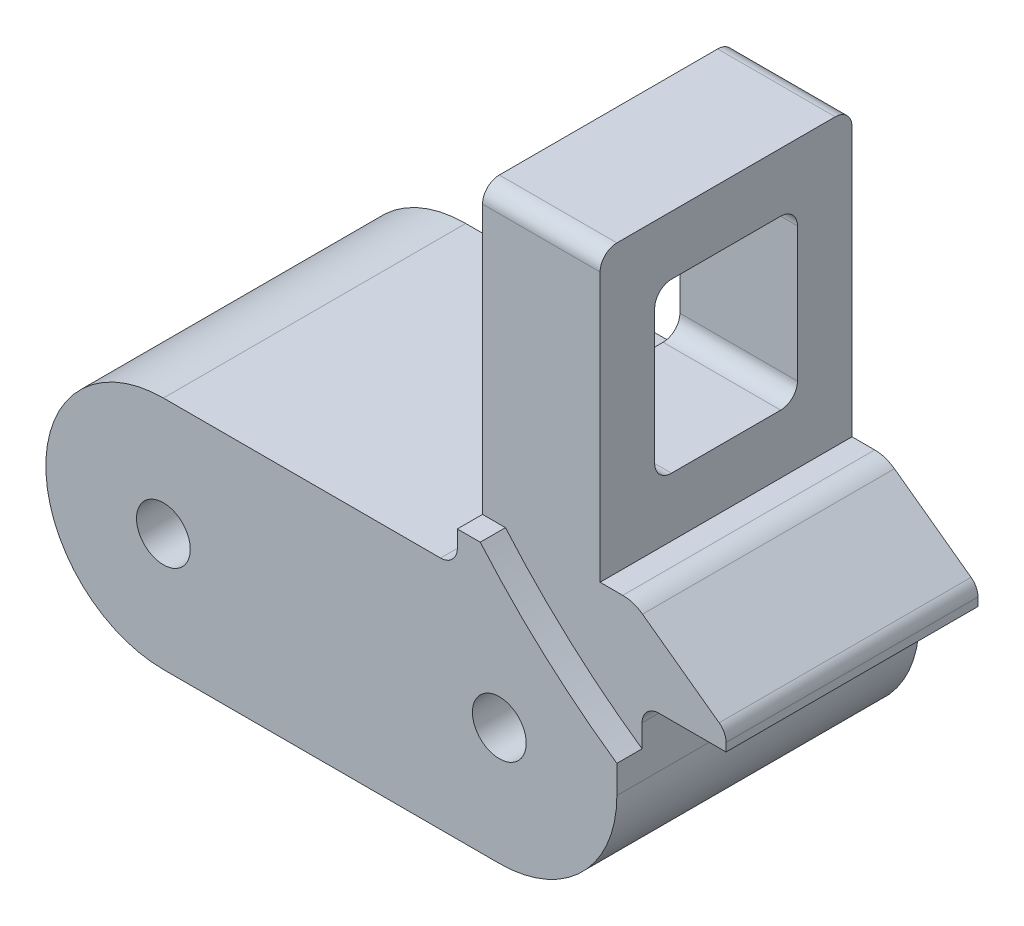
ISO-10303-21;
HEADER;
FILE_DESCRIPTION(('STEP AP214'),'2;1');
FILE_NAME('part.step','',(''),(''),'','','');
FILE_SCHEMA(('AUTOMOTIVE_DESIGN { 1 0 10303 214 1 1 1 1 }'));
ENDSEC;
DATA;
#1=APPLICATION_CONTEXT('core data for automotive mechanical design processes');
#2=APPLICATION_PROTOCOL_DEFINITION('international standard','automotive_design',2000,#1);
#3=PRODUCT_CONTEXT('',#1,'mechanical');
#4=PRODUCT('Part','Part','',(#3));
#5=PRODUCT_RELATED_PRODUCT_CATEGORY('part','',(#4));
#6=PRODUCT_DEFINITION_FORMATION('','',#4);
#7=PRODUCT_DEFINITION_CONTEXT('part definition',#1,'design');
#8=PRODUCT_DEFINITION('design','',#6,#7);
#9=PRODUCT_DEFINITION_SHAPE('','',#8);
#10=(LENGTH_UNIT() NAMED_UNIT(*) SI_UNIT(.MILLI.,.METRE.));
#11=(NAMED_UNIT(*) PLANE_ANGLE_UNIT() SI_UNIT($,.RADIAN.));
#12=(NAMED_UNIT(*) SI_UNIT($,.STERADIAN.) SOLID_ANGLE_UNIT());
#13=UNCERTAINTY_MEASURE_WITH_UNIT(LENGTH_MEASURE(1.E-05),#10,'distance_accuracy_value','');
#14=(GEOMETRIC_REPRESENTATION_CONTEXT(3) GLOBAL_UNCERTAINTY_ASSIGNED_CONTEXT((#13)) GLOBAL_UNIT_ASSIGNED_CONTEXT((#10,
#11,#12)) REPRESENTATION_CONTEXT('',''));
#15=CARTESIAN_POINT('',(0.,0.,0.));
#16=DIRECTION('',(0.,0.,1.));
#17=DIRECTION('',(1.,0.,0.));
#18=AXIS2_PLACEMENT_3D('',#15,#16,#17);
#19=CARTESIAN_POINT('',(0.,4.,14.));
#20=DIRECTION('',(0.,1.,0.));
#21=DIRECTION('',(0.,0.,1.));
#22=AXIS2_PLACEMENT_3D('',#19,#20,#21);
#23=PLANE('',#22);
#24=DIRECTION('',(0.,0.,-1.));
#25=VECTOR('',#24,1.);
#26=CARTESIAN_POINT('',(8.,4.,0.));
#27=LINE('',#26,#25);
#28=CARTESIAN_POINT('',(8.,4.,14.5));
#29=VERTEX_POINT('',#28);
#30=CARTESIAN_POINT('',(8.,4.,-0.5));
#31=VERTEX_POINT('',#30);
#32=EDGE_CURVE('E463',#29,#31,#27,.T.);
#33=ORIENTED_EDGE('',*,*,#32,.T.);
#34=DIRECTION('',(-1.,0.,0.));
#35=VECTOR('',#34,1.);
#36=CARTESIAN_POINT('',(12.,4.,-0.5));
#37=LINE('',#36,#35);
#38=CARTESIAN_POINT('',(12.,4.,-0.5));
#39=VERTEX_POINT('',#38);
#40=EDGE_CURVE('E328',#39,#31,#37,.T.);
#41=ORIENTED_EDGE('',*,*,#40,.F.);
#42=DIRECTION('',(0.,0.,-1.));
#43=VECTOR('',#42,1.);
#44=CARTESIAN_POINT('',(12.,4.,14.));
#45=LINE('',#44,#43);
#46=CARTESIAN_POINT('',(12.,4.,14.5));
#47=VERTEX_POINT('',#46);
#48=EDGE_CURVE('E457',#47,#39,#45,.T.);
#49=ORIENTED_EDGE('',*,*,#48,.F.);
#50=DIRECTION('',(1.,0.,0.));
#51=VECTOR('',#50,1.);
#52=CARTESIAN_POINT('',(8.,4.,14.5));
#53=LINE('',#52,#51);
#54=EDGE_CURVE('E357',#29,#47,#53,.T.);
#55=ORIENTED_EDGE('',*,*,#54,.F.);
#56=EDGE_LOOP('',(#33,#41,#49,#55));
#57=FACE_BOUND('',#56,.T.);
#58=ADVANCED_FACE('F38',(#57),#23,.F.);
#59=CARTESIAN_POINT('',(12.,0.,14.));
#60=DIRECTION('',(-1.,0.,0.));
#61=DIRECTION('',(0.,0.,1.));
#62=AXIS2_PLACEMENT_3D('',#59,#60,#61);
#63=PLANE('',#62);
#64=ORIENTED_EDGE('',*,*,#48,.T.);
#65=DIRECTION('',(0.,-1.,0.));
#66=VECTOR('',#65,1.);
#67=CARTESIAN_POINT('',(12.,4.49077540829678,-0.5));
#68=LINE('',#67,#66);
#69=CARTESIAN_POINT('',(12.,4.49077540829678,-0.5));
#70=VERTEX_POINT('',#69);
#71=EDGE_CURVE('E325',#70,#39,#68,.T.);
#72=ORIENTED_EDGE('',*,*,#71,.F.);
#73=DIRECTION('',(0.,0.,-1.));
#74=VECTOR('',#73,1.);
#75=CARTESIAN_POINT('',(12.,4.49077540829678,14.));
#76=LINE('',#75,#74);
#77=CARTESIAN_POINT('',(12.,4.49077540829678,14.5));
#78=VERTEX_POINT('',#77);
#79=EDGE_CURVE('E478',#70,#78,#76,.F.);
#80=ORIENTED_EDGE('',*,*,#79,.T.);
#81=DIRECTION('',(0.,1.,0.));
#82=VECTOR('',#81,1.);
#83=CARTESIAN_POINT('',(12.,4.,14.5));
#84=LINE('',#83,#82);
#85=EDGE_CURVE('E360',#47,#78,#84,.T.);
#86=ORIENTED_EDGE('',*,*,#85,.F.);
#87=EDGE_LOOP('',(#64,#72,#80,#86));
#88=FACE_BOUND('',#87,.T.);
#89=ADVANCED_FACE('F571',(#88),#63,.F.);
#90=CARTESIAN_POINT('',(6.52972972972973,8.97837837837838,14.));
#91=DIRECTION('',(0.588171697675046,0.808736084303189,0.));
#92=DIRECTION('',(-0.808736084303189,0.588171697675046,0.));
#93=AXIS2_PLACEMENT_3D('',#90,#91,#92);
#94=PLANE('',#93);
#95=DIRECTION('',(0.,0.,-1.));
#96=VECTOR('',#95,1.);
#97=CARTESIAN_POINT('',(11.588171697675,5.29951149259996,0.));
#98=LINE('',#97,#96);
#99=CARTESIAN_POINT('',(11.588171697675,5.29951149259997,14.5));
#100=VERTEX_POINT('',#99);
#101=CARTESIAN_POINT('',(11.588171697675,5.29951149259997,-0.5));
#102=VERTEX_POINT('',#101);
#103=EDGE_CURVE('E476',#100,#102,#98,.T.);
#104=ORIENTED_EDGE('',*,*,#103,.T.);
#105=DIRECTION('',(0.808736084303188,-0.588171697675046,0.));
#106=VECTOR('',#105,1.);
#107=CARTESIAN_POINT('',(7.02597576816623,8.61747216860638,-0.5));
#108=LINE('',#107,#106);
#109=CARTESIAN_POINT('',(7.02597576816623,8.61747216860638,-0.5));
#110=VERTEX_POINT('',#109);
#111=EDGE_CURVE('E319',#110,#102,#108,.T.);
#112=ORIENTED_EDGE('',*,*,#111,.F.);
#113=DIRECTION('',(0.,0.,-1.));
#114=VECTOR('',#113,1.);
#115=CARTESIAN_POINT('',(7.02597576816623,8.61747216860638,14.));
#116=LINE('',#115,#114);
#117=CARTESIAN_POINT('',(7.02597576816623,8.61747216860638,14.5));
#118=VERTEX_POINT('',#117);
#119=EDGE_CURVE('E474',#110,#118,#116,.F.);
#120=ORIENTED_EDGE('',*,*,#119,.T.);
#121=DIRECTION('',(-0.808736084303189,0.588171697675046,0.));
#122=VECTOR('',#121,1.);
#123=CARTESIAN_POINT('',(11.588171697675,5.29951149259997,14.5));
#124=LINE('',#123,#122);
#125=EDGE_CURVE('E366',#100,#118,#124,.T.);
#126=ORIENTED_EDGE('',*,*,#125,.F.);
#127=EDGE_LOOP('',(#104,#112,#120,#126));
#128=FACE_BOUND('',#127,.T.);
#129=ADVANCED_FACE('F562',(#128),#94,.T.);
#130=CARTESIAN_POINT('',(0.,9.,14.));
#131=DIRECTION('',(0.,1.,0.));
#132=DIRECTION('',(0.,0.,1.));
#133=AXIS2_PLACEMENT_3D('',#130,#131,#132);
#134=PLANE('',#133);
#135=DIRECTION('',(-1.,0.,0.));
#136=VECTOR('',#135,1.);
#137=CARTESIAN_POINT('',(-1.13433774416142,8.99999999999999,-0.5));
#138=LINE('',#137,#136);
#139=CARTESIAN_POINT('',(-1.13433774416142,8.99999999999999,-0.5));
#140=VERTEX_POINT('',#139);
#141=CARTESIAN_POINT('',(-2.5,9.,-0.5));
#142=VERTEX_POINT('',#141);
#143=EDGE_CURVE('E340',#140,#142,#138,.T.);
#144=ORIENTED_EDGE('',*,*,#143,.F.);
#145=DIRECTION('',(0.,0.,-1.));
#146=VECTOR('',#145,1.);
#147=CARTESIAN_POINT('',(-1.13433774416143,9.,2.));
#148=LINE('',#147,#146);
#149=CARTESIAN_POINT('',(-1.13433774416142,8.99999999999999,-2.));
#150=VERTEX_POINT('',#149);
#151=EDGE_CURVE('E443',#140,#150,#148,.T.);
#152=ORIENTED_EDGE('',*,*,#151,.T.);
#153=DIRECTION('',(1.,0.,0.));
#154=VECTOR('',#153,1.);
#155=CARTESIAN_POINT('',(-2.5,9.,-2.));
#156=LINE('',#155,#154);
#157=CARTESIAN_POINT('',(-2.5,9.,-2.));
#158=VERTEX_POINT('',#157);
#159=EDGE_CURVE('E405',#158,#150,#156,.T.);
#160=ORIENTED_EDGE('',*,*,#159,.F.);
#161=DIRECTION('',(0.,0.,1.));
#162=VECTOR('',#161,1.);
#163=CARTESIAN_POINT('',(-2.5,9.,14.));
#164=LINE('',#163,#162);
#165=EDGE_CURVE('E449',#158,#142,#164,.T.);
#166=ORIENTED_EDGE('',*,*,#165,.T.);
#167=EDGE_LOOP('',(#144,#152,#160,#166));
#168=FACE_BOUND('',#167,.T.);
#169=ADVANCED_FACE('F522',(#168),#134,.T.);
#170=DIRECTION('',(0.,0.,-1.));
#171=VECTOR('',#170,1.);
#172=CARTESIAN_POINT('',(4.5,9.,14.5));
#173=LINE('',#172,#171);
#174=CARTESIAN_POINT('',(4.5,9.,14.5));
#175=VERTEX_POINT('',#174);
#176=CARTESIAN_POINT('',(4.5,9.,-0.5));
#177=VERTEX_POINT('',#176);
#178=EDGE_CURVE('E295',#175,#177,#173,.T.);
#179=ORIENTED_EDGE('',*,*,#178,.F.);
#180=DIRECTION('',(-1.,0.,0.));
#181=VECTOR('',#180,1.);
#182=CARTESIAN_POINT('',(5.84963237281613,9.,14.5));
#183=LINE('',#182,#181);
#184=CARTESIAN_POINT('',(5.84963237281613,9.,14.5));
#185=VERTEX_POINT('',#184);
#186=EDGE_CURVE('E372',#185,#175,#183,.T.);
#187=ORIENTED_EDGE('',*,*,#186,.F.);
#188=DIRECTION('',(0.,0.,-1.));
#189=VECTOR('',#188,1.);
#190=CARTESIAN_POINT('',(5.84963237281614,9.,14.));
#191=LINE('',#190,#189);
#192=CARTESIAN_POINT('',(5.84963237281613,9.,-0.5));
#193=VERTEX_POINT('',#192);
#194=EDGE_CURVE('E471',#185,#193,#191,.T.);
#195=ORIENTED_EDGE('',*,*,#194,.T.);
#196=DIRECTION('',(1.,0.,0.));
#197=VECTOR('',#196,1.);
#198=CARTESIAN_POINT('',(3.5,9.,-0.5));
#199=LINE('',#198,#197);
#200=EDGE_CURVE('E303',#177,#193,#199,.T.);
#201=ORIENTED_EDGE('',*,*,#200,.F.);
#202=EDGE_LOOP('',(#179,#187,#195,#201));
#203=FACE_BOUND('',#202,.T.);
#204=ADVANCED_FACE('F556',(#203),#134,.T.);
#205=CARTESIAN_POINT('',(8.,3.,14.));
#206=DIRECTION('',(0.,0.,1.));
#207=DIRECTION('',(1.,0.,0.));
#208=AXIS2_PLACEMENT_3D('',#205,#206,#207);
#209=CYLINDRICAL_SURFACE('',#208,1.);
#210=DIRECTION('',(0.,0.,-1.));
#211=VECTOR('',#210,1.);
#212=CARTESIAN_POINT('',(7.,3.,14.));
#213=LINE('',#212,#211);
#214=CARTESIAN_POINT('',(7.,3.,-0.5));
#215=VERTEX_POINT('',#214);
#216=CARTESIAN_POINT('',(7.,3.,14.5));
#217=VERTEX_POINT('',#216);
#218=EDGE_CURVE('E465',#215,#217,#213,.F.);
#219=ORIENTED_EDGE('',*,*,#218,.F.);
#220=CARTESIAN_POINT('',(8.,3.,-0.5));
#221=DIRECTION('',(0.,0.,1.));
#222=DIRECTION('',(-1.,0.,0.));
#223=AXIS2_PLACEMENT_3D('',#220,#221,#222);
#224=CIRCLE('',#223,1.);
#225=EDGE_CURVE('E331',#31,#215,#224,.T.);
#226=ORIENTED_EDGE('',*,*,#225,.F.);
#227=ORIENTED_EDGE('',*,*,#32,.F.);
#228=CARTESIAN_POINT('',(8.,3.,14.5));
#229=DIRECTION('',(0.,0.,-1.));
#230=DIRECTION('',(1.,0.,0.));
#231=AXIS2_PLACEMENT_3D('',#228,#229,#230);
#232=CIRCLE('',#231,1.);
#233=EDGE_CURVE('E354',#217,#29,#232,.T.);
#234=ORIENTED_EDGE('',*,*,#233,.F.);
#235=EDGE_LOOP('',(#219,#226,#227,#234));
#236=FACE_BOUND('',#235,.T.);
#237=ADVANCED_FACE('F578',(#236),#209,.F.);
#238=CARTESIAN_POINT('',(5.84963237281614,7.,14.));
#239=DIRECTION('',(0.,0.,-1.));
#240=DIRECTION('',(-1.,0.,0.));
#241=AXIS2_PLACEMENT_3D('',#238,#239,#240);
#242=CYLINDRICAL_SURFACE('',#241,2.);
#243=ORIENTED_EDGE('',*,*,#119,.F.);
#244=CARTESIAN_POINT('',(5.84963237281614,7.,-0.5));
#245=DIRECTION('',(0.,0.,-1.));
#246=DIRECTION('',(-1.,0.,0.));
#247=AXIS2_PLACEMENT_3D('',#244,#245,#246);
#248=CIRCLE('',#247,2.);
#249=EDGE_CURVE('E316',#193,#110,#248,.T.);
#250=ORIENTED_EDGE('',*,*,#249,.F.);
#251=ORIENTED_EDGE('',*,*,#194,.F.);
#252=CARTESIAN_POINT('',(5.84963237281614,7.,14.5));
#253=DIRECTION('',(0.,0.,1.));
#254=DIRECTION('',(1.,0.,0.));
#255=AXIS2_PLACEMENT_3D('',#252,#253,#254);
#256=CIRCLE('',#255,2.);
#257=EDGE_CURVE('E369',#118,#185,#256,.T.);
#258=ORIENTED_EDGE('',*,*,#257,.F.);
#259=EDGE_LOOP('',(#243,#250,#251,#258));
#260=FACE_BOUND('',#259,.T.);
#261=ADVANCED_FACE('F619',(#260),#242,.T.);
#262=CARTESIAN_POINT('',(11.,4.49077540829678,14.));
#263=DIRECTION('',(0.,0.,1.));
#264=DIRECTION('',(1.,0.,0.));
#265=AXIS2_PLACEMENT_3D('',#262,#263,#264);
#266=CYLINDRICAL_SURFACE('',#265,1.);
#267=ORIENTED_EDGE('',*,*,#79,.F.);
#268=CARTESIAN_POINT('',(11.,4.49077540829678,-0.5));
#269=DIRECTION('',(0.,0.,-1.));
#270=DIRECTION('',(-1.,0.,0.));
#271=AXIS2_PLACEMENT_3D('',#268,#269,#270);
#272=CIRCLE('',#271,1.);
#273=EDGE_CURVE('E322',#102,#70,#272,.T.);
#274=ORIENTED_EDGE('',*,*,#273,.F.);
#275=ORIENTED_EDGE('',*,*,#103,.F.);
#276=CARTESIAN_POINT('',(11.,4.49077540829678,14.5));
#277=DIRECTION('',(0.,0.,1.));
#278=DIRECTION('',(1.,0.,0.));
#279=AXIS2_PLACEMENT_3D('',#276,#277,#278);
#280=CIRCLE('',#279,1.);
#281=EDGE_CURVE('E363',#78,#100,#280,.T.);
#282=ORIENTED_EDGE('',*,*,#281,.F.);
#283=EDGE_LOOP('',(#267,#274,#275,#282));
#284=FACE_BOUND('',#283,.T.);
#285=ADVANCED_FACE('F566',(#284),#266,.T.);
#286=CARTESIAN_POINT('',(7.,0.,14.));
#287=DIRECTION('',(-1.,0.,0.));
#288=DIRECTION('',(0.,0.,1.));
#289=AXIS2_PLACEMENT_3D('',#286,#287,#288);
#290=PLANE('',#289);
#291=ORIENTED_EDGE('',*,*,#218,.T.);
#292=DIRECTION('',(0.,1.,0.));
#293=VECTOR('',#292,1.);
#294=CARTESIAN_POINT('',(6.99999999999999,1.66234303183078,14.5));
#295=LINE('',#294,#293);
#296=CARTESIAN_POINT('',(6.99999999999999,1.66234303183078,14.5));
#297=VERTEX_POINT('',#296);
#298=EDGE_CURVE('E351',#297,#217,#295,.T.);
#299=ORIENTED_EDGE('',*,*,#298,.F.);
#300=DIRECTION('',(0.,0.,1.));
#301=VECTOR('',#300,1.);
#302=CARTESIAN_POINT('',(7.,1.66234303183078,12.));
#303=LINE('',#302,#301);
#304=CARTESIAN_POINT('',(6.99999999999999,1.66234303183078,16.));
#305=VERTEX_POINT('',#304);
#306=EDGE_CURVE('E447',#297,#305,#303,.T.);
#307=ORIENTED_EDGE('',*,*,#306,.T.);
#308=DIRECTION('',(0.,1.,0.));
#309=VECTOR('',#308,1.);
#310=CARTESIAN_POINT('',(7.,0.,16.));
#311=LINE('',#310,#309);
#312=CARTESIAN_POINT('',(7.,0.,16.));
#313=VERTEX_POINT('',#312);
#314=EDGE_CURVE('E438',#313,#305,#311,.T.);
#315=ORIENTED_EDGE('',*,*,#314,.F.);
#316=DIRECTION('',(0.,0.,-1.));
#317=VECTOR('',#316,1.);
#318=CARTESIAN_POINT('',(7.,0.,14.));
#319=LINE('',#318,#317);
#320=CARTESIAN_POINT('',(7.,0.,-2.));
#321=VERTEX_POINT('',#320);
#322=EDGE_CURVE('E459',#313,#321,#319,.T.);
#323=ORIENTED_EDGE('',*,*,#322,.T.);
#324=DIRECTION('',(0.,-1.,0.));
#325=VECTOR('',#324,1.);
#326=CARTESIAN_POINT('',(7.00000000000001,1.66234303183077,-2.));
#327=LINE('',#326,#325);
#328=CARTESIAN_POINT('',(7.00000000000001,1.66234303183077,-2.));
#329=VERTEX_POINT('',#328);
#330=EDGE_CURVE('E384',#329,#321,#327,.T.);
#331=ORIENTED_EDGE('',*,*,#330,.F.);
#332=DIRECTION('',(0.,0.,-1.));
#333=VECTOR('',#332,1.);
#334=CARTESIAN_POINT('',(7.,1.66234303183078,2.));
#335=LINE('',#334,#333);
#336=CARTESIAN_POINT('',(7.,1.66234303183078,-0.5));
#337=VERTEX_POINT('',#336);
#338=EDGE_CURVE('E441',#337,#329,#335,.T.);
#339=ORIENTED_EDGE('',*,*,#338,.F.);
#340=DIRECTION('',(0.,-1.,0.));
#341=VECTOR('',#340,1.);
#342=CARTESIAN_POINT('',(7.,3.,-0.5));
#343=LINE('',#342,#341);
#344=EDGE_CURVE('E334',#215,#337,#343,.T.);
#345=ORIENTED_EDGE('',*,*,#344,.F.);
#346=EDGE_LOOP('',(#291,#299,#307,#315,#323,#331,#339,#345));
#347=FACE_BOUND('',#346,.T.);
#348=ADVANCED_FACE('F583',(#347),#290,.F.);
#349=CARTESIAN_POINT('',(0.,-7.,14.));
#350=DIRECTION('',(0.,1.,0.));
#351=DIRECTION('',(0.,0.,1.));
#352=AXIS2_PLACEMENT_3D('',#349,#350,#351);
#353=PLANE('',#352);
#354=DIRECTION('',(0.,0.,-1.));
#355=VECTOR('',#354,1.);
#356=CARTESIAN_POINT('',(-20.,-7.,14.));
#357=LINE('',#356,#355);
#358=CARTESIAN_POINT('',(-20.,-7.,16.));
#359=VERTEX_POINT('',#358);
#360=CARTESIAN_POINT('',(-20.,-7.,-2.));
#361=VERTEX_POINT('',#360);
#362=EDGE_CURVE('E453',#359,#361,#357,.T.);
#363=ORIENTED_EDGE('',*,*,#362,.T.);
#364=DIRECTION('',(-1.,0.,0.));
#365=VECTOR('',#364,1.);
#366=CARTESIAN_POINT('',(0.,-7.,-2.));
#367=LINE('',#366,#365);
#368=CARTESIAN_POINT('',(0.,-7.,-2.));
#369=VERTEX_POINT('',#368);
#370=EDGE_CURVE('E390',#369,#361,#367,.T.);
#371=ORIENTED_EDGE('',*,*,#370,.F.);
#372=DIRECTION('',(0.,0.,-1.));
#373=VECTOR('',#372,1.);
#374=CARTESIAN_POINT('',(0.,-7.,14.));
#375=LINE('',#374,#373);
#376=CARTESIAN_POINT('',(0.,-7.,16.));
#377=VERTEX_POINT('',#376);
#378=EDGE_CURVE('E461',#377,#369,#375,.T.);
#379=ORIENTED_EDGE('',*,*,#378,.F.);
#380=DIRECTION('',(1.,0.,0.));
#381=VECTOR('',#380,1.);
#382=CARTESIAN_POINT('',(-20.,-7.,16.));
#383=LINE('',#382,#381);
#384=EDGE_CURVE('E432',#359,#377,#383,.T.);
#385=ORIENTED_EDGE('',*,*,#384,.F.);
#386=EDGE_LOOP('',(#363,#371,#379,#385));
#387=FACE_BOUND('',#386,.T.);
#388=ADVANCED_FACE('F610',(#387),#353,.F.);
#389=CARTESIAN_POINT('',(0.,0.,14.));
#390=DIRECTION('',(0.,0.,-1.));
#391=DIRECTION('',(-1.,0.,0.));
#392=AXIS2_PLACEMENT_3D('',#389,#390,#391);
#393=CYLINDRICAL_SURFACE('',#392,7.);
#394=ORIENTED_EDGE('',*,*,#378,.T.);
#395=CARTESIAN_POINT('',(0.,0.,-2.));
#396=DIRECTION('',(0.,0.,-1.));
#397=DIRECTION('',(-1.,0.,0.));
#398=AXIS2_PLACEMENT_3D('',#395,#396,#397);
#399=CIRCLE('',#398,7.);
#400=EDGE_CURVE('E387',#321,#369,#399,.T.);
#401=ORIENTED_EDGE('',*,*,#400,.F.);
#402=ORIENTED_EDGE('',*,*,#322,.F.);
#403=CARTESIAN_POINT('',(0.,0.,16.));
#404=DIRECTION('',(0.,0.,1.));
#405=DIRECTION('',(1.,0.,0.));
#406=AXIS2_PLACEMENT_3D('',#403,#404,#405);
#407=CIRCLE('',#406,7.);
#408=EDGE_CURVE('E435',#377,#313,#407,.T.);
#409=ORIENTED_EDGE('',*,*,#408,.F.);
#410=EDGE_LOOP('',(#394,#401,#402,#409));
#411=FACE_BOUND('',#410,.T.);
#412=ADVANCED_FACE('F611',(#411),#393,.T.);
#413=DIRECTION('',(1.,0.,0.));
#414=VECTOR('',#413,1.);
#415=CARTESIAN_POINT('',(-2.5,9.,14.5));
#416=LINE('',#415,#414);
#417=CARTESIAN_POINT('',(-2.5,9.,14.5));
#418=VERTEX_POINT('',#417);
#419=CARTESIAN_POINT('',(-1.13433774416143,9.,14.5));
#420=VERTEX_POINT('',#419);
#421=EDGE_CURVE('E347',#418,#420,#416,.T.);
#422=ORIENTED_EDGE('',*,*,#421,.F.);
#423=DIRECTION('',(0.,0.,1.));
#424=VECTOR('',#423,1.);
#425=CARTESIAN_POINT('',(-2.5,9.,14.));
#426=LINE('',#425,#424);
#427=CARTESIAN_POINT('',(-2.5,9.,16.));
#428=VERTEX_POINT('',#427);
#429=EDGE_CURVE('E451',#418,#428,#426,.T.);
#430=ORIENTED_EDGE('',*,*,#429,.T.);
#431=DIRECTION('',(-1.,0.,0.));
#432=VECTOR('',#431,1.);
#433=CARTESIAN_POINT('',(-1.13433774416143,9.00000000000002,16.));
#434=LINE('',#433,#432);
#435=CARTESIAN_POINT('',(-1.13433774416143,9.00000000000002,16.));
#436=VERTEX_POINT('',#435);
#437=EDGE_CURVE('E417',#436,#428,#434,.T.);
#438=ORIENTED_EDGE('',*,*,#437,.F.);
#439=DIRECTION('',(0.,0.,1.));
#440=VECTOR('',#439,1.);
#441=CARTESIAN_POINT('',(-1.13433774416143,9.,12.));
#442=LINE('',#441,#440);
#443=EDGE_CURVE('E445',#420,#436,#442,.T.);
#444=ORIENTED_EDGE('',*,*,#443,.F.);
#445=EDGE_LOOP('',(#422,#430,#438,#444));
#446=FACE_BOUND('',#445,.T.);
#447=ADVANCED_FACE('F545',(#446),#134,.T.);
#448=CARTESIAN_POINT('',(-2.5,0.,14.));
#449=DIRECTION('',(-1.,0.,0.));
#450=DIRECTION('',(0.,-1.,0.));
#451=AXIS2_PLACEMENT_3D('',#448,#449,#450);
#452=PLANE('',#451);
#453=CARTESIAN_POINT('',(-2.5,21.5,10.25));
#454=DIRECTION('',(-1.,0.,0.));
#455=DIRECTION('',(0.,-1.,0.));
#456=AXIS2_PLACEMENT_3D('',#453,#454,#455);
#457=CIRCLE('',#456,0.999999999999998);
#458=CARTESIAN_POINT('',(-2.50000000000001,21.5,11.25));
#459=VERTEX_POINT('',#458);
#460=CARTESIAN_POINT('',(-2.50000000000001,22.5,10.25));
#461=VERTEX_POINT('',#460);
#462=EDGE_CURVE('E494',#459,#461,#457,.T.);
#463=ORIENTED_EDGE('',*,*,#462,.F.);
#464=DIRECTION('',(0.,1.,0.));
#465=VECTOR('',#464,1.);
#466=CARTESIAN_POINT('',(-2.5,0.,11.25));
#467=LINE('',#466,#465);
#468=CARTESIAN_POINT('',(-2.5,13.5,11.25));
#469=VERTEX_POINT('',#468);
#470=EDGE_CURVE('E480',#469,#459,#467,.T.);
#471=ORIENTED_EDGE('',*,*,#470,.F.);
#472=CARTESIAN_POINT('',(-2.5,13.5,10.25));
#473=DIRECTION('',(-1.,0.,0.));
#474=DIRECTION('',(0.,-1.,0.));
#475=AXIS2_PLACEMENT_3D('',#472,#473,#474);
#476=CIRCLE('',#475,1.);
#477=CARTESIAN_POINT('',(-2.50000000000001,12.5,10.25));
#478=VERTEX_POINT('',#477);
#479=EDGE_CURVE('E482',#478,#469,#476,.T.);
#480=ORIENTED_EDGE('',*,*,#479,.F.);
#481=DIRECTION('',(0.,0.,1.));
#482=VECTOR('',#481,1.);
#483=CARTESIAN_POINT('',(-2.5,12.5,14.));
#484=LINE('',#483,#482);
#485=CARTESIAN_POINT('',(-2.50000000000001,12.5,3.75));
#486=VERTEX_POINT('',#485);
#487=EDGE_CURVE('E485',#486,#478,#484,.T.);
#488=ORIENTED_EDGE('',*,*,#487,.F.);
#489=CARTESIAN_POINT('',(-2.5,13.5,3.75));
#490=DIRECTION('',(-1.,0.,0.));
#491=DIRECTION('',(0.,-1.,0.));
#492=AXIS2_PLACEMENT_3D('',#489,#490,#491);
#493=CIRCLE('',#492,0.999999999999999);
#494=CARTESIAN_POINT('',(-2.50000000000001,13.5,2.75));
#495=VERTEX_POINT('',#494);
#496=EDGE_CURVE('E487',#495,#486,#493,.T.);
#497=ORIENTED_EDGE('',*,*,#496,.F.);
#498=DIRECTION('',(0.,-1.,0.));
#499=VECTOR('',#498,1.);
#500=CARTESIAN_POINT('',(-2.5,0.,2.75));
#501=LINE('',#500,#499);
#502=CARTESIAN_POINT('',(-2.50000000000001,21.5,2.75));
#503=VERTEX_POINT('',#502);
#504=EDGE_CURVE('E489',#503,#495,#501,.T.);
#505=ORIENTED_EDGE('',*,*,#504,.F.);
#506=CARTESIAN_POINT('',(-2.5,21.5,3.75));
#507=DIRECTION('',(-1.,0.,0.));
#508=DIRECTION('',(0.,-1.,0.));
#509=AXIS2_PLACEMENT_3D('',#506,#507,#508);
#510=CIRCLE('',#509,0.999999999999999);
#511=CARTESIAN_POINT('',(-2.50000000000001,22.5,3.75));
#512=VERTEX_POINT('',#511);
#513=EDGE_CURVE('E491',#512,#503,#510,.T.);
#514=ORIENTED_EDGE('',*,*,#513,.F.);
#515=DIRECTION('',(0.,0.,-1.));
#516=VECTOR('',#515,1.);
#517=CARTESIAN_POINT('',(-2.5,22.5,14.));
#518=LINE('',#517,#516);
#519=EDGE_CURVE('E256',#461,#512,#518,.T.);
#520=ORIENTED_EDGE('',*,*,#519,.F.);
#521=EDGE_LOOP('',(#463,#471,#480,#488,#497,#505,#514,#520));
#522=FACE_BOUND('',#521,.T.);
#523=DIRECTION('',(0.,0.,1.));
#524=VECTOR('',#523,1.);
#525=CARTESIAN_POINT('',(-2.5,26.,-0.5));
#526=LINE('',#525,#524);
#527=CARTESIAN_POINT('',(-2.5,26.,0.5));
#528=VERTEX_POINT('',#527);
#529=CARTESIAN_POINT('',(-2.5,26.,13.5));
#530=VERTEX_POINT('',#529);
#531=EDGE_CURVE('E299',#528,#530,#526,.T.);
#532=ORIENTED_EDGE('',*,*,#531,.F.);
#533=CARTESIAN_POINT('',(-2.5,25.,0.5));
#534=DIRECTION('',(-1.,0.,0.));
#535=DIRECTION('',(0.,-1.,0.));
#536=AXIS2_PLACEMENT_3D('',#533,#534,#535);
#537=CIRCLE('',#536,1.);
#538=CARTESIAN_POINT('',(-2.5,25.,-0.5));
#539=VERTEX_POINT('',#538);
#540=EDGE_CURVE('E504',#528,#539,#537,.T.);
#541=ORIENTED_EDGE('',*,*,#540,.T.);
#542=DIRECTION('',(0.,1.,0.));
#543=VECTOR('',#542,1.);
#544=CARTESIAN_POINT('',(-2.5,9.,-0.5));
#545=LINE('',#544,#543);
#546=EDGE_CURVE('E343',#142,#539,#545,.T.);
#547=ORIENTED_EDGE('',*,*,#546,.F.);
#548=ORIENTED_EDGE('',*,*,#165,.F.);
#549=DIRECTION('',(0.,1.,0.));
#550=VECTOR('',#549,1.);
#551=CARTESIAN_POINT('',(-2.5,8.,-2.));
#552=LINE('',#551,#550);
#553=CARTESIAN_POINT('',(-2.5,8.,-2.));
#554=VERTEX_POINT('',#553);
#555=EDGE_CURVE('E402',#554,#158,#552,.T.);
#556=ORIENTED_EDGE('',*,*,#555,.F.);
#557=DIRECTION('',(0.,0.,-1.));
#558=VECTOR('',#557,1.);
#559=CARTESIAN_POINT('',(-2.5,8.,14.));
#560=LINE('',#559,#558);
#561=CARTESIAN_POINT('',(-2.5,8.,16.));
#562=VERTEX_POINT('',#561);
#563=EDGE_CURVE('E469',#554,#562,#560,.F.);
#564=ORIENTED_EDGE('',*,*,#563,.T.);
#565=DIRECTION('',(0.,-1.,0.));
#566=VECTOR('',#565,1.);
#567=CARTESIAN_POINT('',(-2.5,9.,16.));
#568=LINE('',#567,#566);
#569=EDGE_CURVE('E420',#428,#562,#568,.T.);
#570=ORIENTED_EDGE('',*,*,#569,.F.);
#571=ORIENTED_EDGE('',*,*,#429,.F.);
#572=DIRECTION('',(0.,-1.,0.));
#573=VECTOR('',#572,1.);
#574=CARTESIAN_POINT('',(-2.5,25.,14.5));
#575=LINE('',#574,#573);
#576=CARTESIAN_POINT('',(-2.5,25.,14.5));
#577=VERTEX_POINT('',#576);
#578=EDGE_CURVE('E345',#577,#418,#575,.T.);
#579=ORIENTED_EDGE('',*,*,#578,.F.);
#580=CARTESIAN_POINT('',(-2.5,25.,13.5));
#581=DIRECTION('',(-1.,0.,0.));
#582=DIRECTION('',(0.,-1.,0.));
#583=AXIS2_PLACEMENT_3D('',#580,#581,#582);
#584=CIRCLE('',#583,1.);
#585=EDGE_CURVE('E502',#577,#530,#584,.T.);
#586=ORIENTED_EDGE('',*,*,#585,.T.);
#587=EDGE_LOOP('',(#532,#541,#547,#548,#556,#564,#570,#571,#579,#586));
#588=FACE_BOUND('',#587,.T.);
#589=ADVANCED_FACE('F518',(#522,#588),#452,.T.);
#590=CARTESIAN_POINT('',(0.,7.,14.));
#591=DIRECTION('',(0.,1.,0.));
#592=DIRECTION('',(0.,0.,1.));
#593=AXIS2_PLACEMENT_3D('',#590,#591,#592);
#594=PLANE('',#593);
#595=DIRECTION('',(0.,0.,-1.));
#596=VECTOR('',#595,1.);
#597=CARTESIAN_POINT('',(-20.,7.,14.));
#598=LINE('',#597,#596);
#599=CARTESIAN_POINT('',(-20.,7.,16.));
#600=VERTEX_POINT('',#599);
#601=CARTESIAN_POINT('',(-20.,7.,-2.));
#602=VERTEX_POINT('',#601);
#603=EDGE_CURVE('E455',#600,#602,#598,.T.);
#604=ORIENTED_EDGE('',*,*,#603,.F.);
#605=DIRECTION('',(-1.,0.,0.));
#606=VECTOR('',#605,1.);
#607=CARTESIAN_POINT('',(-3.5,7.,16.));
#608=LINE('',#607,#606);
#609=CARTESIAN_POINT('',(-3.5,7.,16.));
#610=VERTEX_POINT('',#609);
#611=EDGE_CURVE('E426',#610,#600,#608,.T.);
#612=ORIENTED_EDGE('',*,*,#611,.F.);
#613=DIRECTION('',(0.,0.,-1.));
#614=VECTOR('',#613,1.);
#615=CARTESIAN_POINT('',(-3.5,7.,0.));
#616=LINE('',#615,#614);
#617=CARTESIAN_POINT('',(-3.5,7.,-2.));
#618=VERTEX_POINT('',#617);
#619=EDGE_CURVE('E467',#610,#618,#616,.T.);
#620=ORIENTED_EDGE('',*,*,#619,.T.);
#621=DIRECTION('',(1.,0.,0.));
#622=VECTOR('',#621,1.);
#623=CARTESIAN_POINT('',(-20.,7.,-2.));
#624=LINE('',#623,#622);
#625=EDGE_CURVE('E396',#602,#618,#624,.T.);
#626=ORIENTED_EDGE('',*,*,#625,.F.);
#627=EDGE_LOOP('',(#604,#612,#620,#626));
#628=FACE_BOUND('',#627,.T.);
#629=ADVANCED_FACE('F688',(#628),#594,.T.);
#630=CARTESIAN_POINT('',(-20.,0.,14.));
#631=DIRECTION('',(0.,0.,-1.));
#632=DIRECTION('',(-1.,0.,0.));
#633=AXIS2_PLACEMENT_3D('',#630,#631,#632);
#634=CYLINDRICAL_SURFACE('',#633,1.6);
#635=CARTESIAN_POINT('',(-20.,0.,16.));
#636=DIRECTION('',(0.,0.,1.));
#637=DIRECTION('',(1.,0.,0.));
#638=AXIS2_PLACEMENT_3D('',#635,#636,#637);
#639=CIRCLE('',#638,1.6);
#640=CARTESIAN_POINT('',(-18.4,0.,16.));
#641=VERTEX_POINT('',#640);
#642=EDGE_CURVE('E408',#641,#641,#639,.T.);
#643=ORIENTED_EDGE('',*,*,#642,.T.);
#644=EDGE_LOOP('',(#643));
#645=FACE_BOUND('',#644,.T.);
#646=CARTESIAN_POINT('',(-20.,0.,-2.));
#647=DIRECTION('',(0.,0.,-1.));
#648=DIRECTION('',(-1.,0.,0.));
#649=AXIS2_PLACEMENT_3D('',#646,#647,#648);
#650=CIRCLE('',#649,1.6);
#651=CARTESIAN_POINT('',(-21.6,0.,-2.));
#652=VERTEX_POINT('',#651);
#653=EDGE_CURVE('E378',#652,#652,#650,.T.);
#654=ORIENTED_EDGE('',*,*,#653,.T.);
#655=EDGE_LOOP('',(#654));
#656=FACE_BOUND('',#655,.T.);
#657=ADVANCED_FACE('F683',(#645,#656),#634,.F.);
#658=CARTESIAN_POINT('',(-20.,0.,14.));
#659=DIRECTION('',(0.,0.,-1.));
#660=DIRECTION('',(-1.,0.,0.));
#661=AXIS2_PLACEMENT_3D('',#658,#659,#660);
#662=CYLINDRICAL_SURFACE('',#661,7.);
#663=ORIENTED_EDGE('',*,*,#603,.T.);
#664=CARTESIAN_POINT('',(-20.,0.,-2.));
#665=DIRECTION('',(0.,0.,-1.));
#666=DIRECTION('',(-1.,0.,0.));
#667=AXIS2_PLACEMENT_3D('',#664,#665,#666);
#668=CIRCLE('',#667,7.);
#669=EDGE_CURVE('E393',#361,#602,#668,.T.);
#670=ORIENTED_EDGE('',*,*,#669,.F.);
#671=ORIENTED_EDGE('',*,*,#362,.F.);
#672=CARTESIAN_POINT('',(-20.,0.,16.));
#673=DIRECTION('',(0.,0.,1.));
#674=DIRECTION('',(1.,0.,0.));
#675=AXIS2_PLACEMENT_3D('',#672,#673,#674);
#676=CIRCLE('',#675,7.);
#677=EDGE_CURVE('E429',#600,#359,#676,.T.);
#678=ORIENTED_EDGE('',*,*,#677,.F.);
#679=EDGE_LOOP('',(#663,#670,#671,#678));
#680=FACE_BOUND('',#679,.T.);
#681=ADVANCED_FACE('F678',(#680),#662,.T.);
#682=CARTESIAN_POINT('',(0.,0.,14.));
#683=DIRECTION('',(0.,0.,-1.));
#684=DIRECTION('',(-1.,0.,0.));
#685=AXIS2_PLACEMENT_3D('',#682,#683,#684);
#686=CYLINDRICAL_SURFACE('',#685,1.6);
#687=CARTESIAN_POINT('',(0.,0.,16.));
#688=DIRECTION('',(0.,0.,1.));
#689=DIRECTION('',(1.,0.,0.));
#690=AXIS2_PLACEMENT_3D('',#687,#688,#689);
#691=CIRCLE('',#690,1.6);
#692=CARTESIAN_POINT('',(1.6,0.,16.));
#693=VERTEX_POINT('',#692);
#694=EDGE_CURVE('E411',#693,#693,#691,.T.);
#695=ORIENTED_EDGE('',*,*,#694,.T.);
#696=EDGE_LOOP('',(#695));
#697=FACE_BOUND('',#696,.T.);
#698=CARTESIAN_POINT('',(0.,0.,-2.));
#699=DIRECTION('',(0.,0.,-1.));
#700=DIRECTION('',(-1.,0.,0.));
#701=AXIS2_PLACEMENT_3D('',#698,#699,#700);
#702=CIRCLE('',#701,1.6);
#703=CARTESIAN_POINT('',(-1.6,0.,-2.));
#704=VERTEX_POINT('',#703);
#705=EDGE_CURVE('E375',#704,#704,#702,.T.);
#706=ORIENTED_EDGE('',*,*,#705,.T.);
#707=EDGE_LOOP('',(#706));
#708=FACE_BOUND('',#707,.T.);
#709=ADVANCED_FACE('F597',(#697,#708),#686,.F.);
#710=CARTESIAN_POINT('',(-3.5,8.,14.));
#711=DIRECTION('',(0.,0.,1.));
#712=DIRECTION('',(1.,0.,0.));
#713=AXIS2_PLACEMENT_3D('',#710,#711,#712);
#714=CYLINDRICAL_SURFACE('',#713,1.);
#715=ORIENTED_EDGE('',*,*,#619,.F.);
#716=CARTESIAN_POINT('',(-3.5,8.,16.));
#717=DIRECTION('',(0.,0.,-1.));
#718=DIRECTION('',(1.,0.,0.));
#719=AXIS2_PLACEMENT_3D('',#716,#717,#718);
#720=CIRCLE('',#719,1.);
#721=EDGE_CURVE('E423',#562,#610,#720,.T.);
#722=ORIENTED_EDGE('',*,*,#721,.F.);
#723=ORIENTED_EDGE('',*,*,#563,.F.);
#724=CARTESIAN_POINT('',(-3.5,8.,-2.));
#725=DIRECTION('',(0.,0.,1.));
#726=DIRECTION('',(-1.,0.,0.));
#727=AXIS2_PLACEMENT_3D('',#724,#725,#726);
#728=CIRCLE('',#727,1.);
#729=EDGE_CURVE('E399',#618,#554,#728,.T.);
#730=ORIENTED_EDGE('',*,*,#729,.F.);
#731=EDGE_LOOP('',(#715,#722,#723,#730));
#732=FACE_BOUND('',#731,.T.);
#733=ADVANCED_FACE('F532',(#732),#714,.F.);
#734=CARTESIAN_POINT('',(31.5,37.,12.));
#735=DIRECTION('',(0.,0.,1.));
#736=DIRECTION('',(1.,0.,0.));
#737=AXIS2_PLACEMENT_3D('',#734,#735,#736);
#738=CYLINDRICAL_SURFACE('',#737,43.);
#739=ORIENTED_EDGE('',*,*,#306,.F.);
#740=CARTESIAN_POINT('',(31.5,37.,14.5));
#741=DIRECTION('',(0.,0.,1.));
#742=DIRECTION('',(1.,0.,0.));
#743=AXIS2_PLACEMENT_3D('',#740,#741,#742);
#744=CIRCLE('',#743,43.);
#745=EDGE_CURVE('E349',#420,#297,#744,.T.);
#746=ORIENTED_EDGE('',*,*,#745,.F.);
#747=ORIENTED_EDGE('',*,*,#443,.T.);
#748=CARTESIAN_POINT('',(31.5,37.,16.));
#749=DIRECTION('',(0.,0.,-1.));
#750=DIRECTION('',(1.,0.,0.));
#751=AXIS2_PLACEMENT_3D('',#748,#749,#750);
#752=CIRCLE('',#751,43.);
#753=EDGE_CURVE('E414',#305,#436,#752,.T.);
#754=ORIENTED_EDGE('',*,*,#753,.F.);
#755=EDGE_LOOP('',(#739,#746,#747,#754));
#756=FACE_BOUND('',#755,.T.);
#757=ADVANCED_FACE('F587',(#756),#738,.F.);
#758=CARTESIAN_POINT('',(31.5,37.,2.));
#759=DIRECTION('',(0.,0.,-1.));
#760=DIRECTION('',(-1.,0.,0.));
#761=AXIS2_PLACEMENT_3D('',#758,#759,#760);
#762=CYLINDRICAL_SURFACE('',#761,43.);
#763=CARTESIAN_POINT('',(31.5,37.,-0.5));
#764=DIRECTION('',(0.,0.,-1.));
#765=DIRECTION('',(-1.,0.,0.));
#766=AXIS2_PLACEMENT_3D('',#763,#764,#765);
#767=CIRCLE('',#766,43.);
#768=EDGE_CURVE('E337',#337,#140,#767,.T.);
#769=ORIENTED_EDGE('',*,*,#768,.F.);
#770=ORIENTED_EDGE('',*,*,#338,.T.);
#771=CARTESIAN_POINT('',(31.5,37.,-2.));
#772=DIRECTION('',(0.,0.,1.));
#773=DIRECTION('',(-1.,0.,0.));
#774=AXIS2_PLACEMENT_3D('',#771,#772,#773);
#775=CIRCLE('',#774,43.);
#776=EDGE_CURVE('E381',#150,#329,#775,.T.);
#777=ORIENTED_EDGE('',*,*,#776,.F.);
#778=ORIENTED_EDGE('',*,*,#151,.F.);
#779=EDGE_LOOP('',(#769,#770,#777,#778));
#780=FACE_BOUND('',#779,.T.);
#781=ADVANCED_FACE('F589',(#780),#762,.F.);
#782=CARTESIAN_POINT('',(31.5,37.,16.));
#783=DIRECTION('',(0.,0.,1.));
#784=DIRECTION('',(1.,0.,0.));
#785=AXIS2_PLACEMENT_3D('',#782,#783,#784);
#786=PLANE('',#785);
#787=ORIENTED_EDGE('',*,*,#694,.F.);
#788=EDGE_LOOP('',(#787));
#789=FACE_BOUND('',#788,.T.);
#790=ORIENTED_EDGE('',*,*,#753,.T.);
#791=ORIENTED_EDGE('',*,*,#437,.T.);
#792=ORIENTED_EDGE('',*,*,#569,.T.);
#793=ORIENTED_EDGE('',*,*,#721,.T.);
#794=ORIENTED_EDGE('',*,*,#611,.T.);
#795=ORIENTED_EDGE('',*,*,#677,.T.);
#796=ORIENTED_EDGE('',*,*,#384,.T.);
#797=ORIENTED_EDGE('',*,*,#408,.T.);
#798=ORIENTED_EDGE('',*,*,#314,.T.);
#799=EDGE_LOOP('',(#790,#791,#792,#793,#794,#795,#796,#797,#798));
#800=FACE_BOUND('',#799,.T.);
#801=ORIENTED_EDGE('',*,*,#642,.F.);
#802=EDGE_LOOP('',(#801));
#803=FACE_BOUND('',#802,.T.);
#804=ADVANCED_FACE('F537',(#789,#800,#803),#786,.T.);
#805=CARTESIAN_POINT('',(31.5,37.,-2.));
#806=DIRECTION('',(0.,0.,-1.));
#807=DIRECTION('',(-1.,0.,0.));
#808=AXIS2_PLACEMENT_3D('',#805,#806,#807);
#809=PLANE('',#808);
#810=ORIENTED_EDGE('',*,*,#653,.F.);
#811=EDGE_LOOP('',(#810));
#812=FACE_BOUND('',#811,.T.);
#813=ORIENTED_EDGE('',*,*,#776,.T.);
#814=ORIENTED_EDGE('',*,*,#330,.T.);
#815=ORIENTED_EDGE('',*,*,#400,.T.);
#816=ORIENTED_EDGE('',*,*,#370,.T.);
#817=ORIENTED_EDGE('',*,*,#669,.T.);
#818=ORIENTED_EDGE('',*,*,#625,.T.);
#819=ORIENTED_EDGE('',*,*,#729,.T.);
#820=ORIENTED_EDGE('',*,*,#555,.T.);
#821=ORIENTED_EDGE('',*,*,#159,.T.);
#822=EDGE_LOOP('',(#813,#814,#815,#816,#817,#818,#819,#820,#821));
#823=FACE_BOUND('',#822,.T.);
#824=ORIENTED_EDGE('',*,*,#705,.F.);
#825=EDGE_LOOP('',(#824));
#826=FACE_BOUND('',#825,.T.);
#827=ADVANCED_FACE('F526',(#812,#823,#826),#809,.T.);
#828=CARTESIAN_POINT('',(31.5,37.,14.5));
#829=DIRECTION('',(0.,0.,1.));
#830=DIRECTION('',(1.,0.,0.));
#831=AXIS2_PLACEMENT_3D('',#828,#829,#830);
#832=PLANE('',#831);
#833=DIRECTION('',(0.,-1.,0.));
#834=VECTOR('',#833,1.);
#835=CARTESIAN_POINT('',(4.5,26.,14.5));
#836=LINE('',#835,#834);
#837=CARTESIAN_POINT('',(4.5,25.,14.5));
#838=VERTEX_POINT('',#837);
#839=EDGE_CURVE('E293',#838,#175,#836,.T.);
#840=ORIENTED_EDGE('',*,*,#839,.F.);
#841=DIRECTION('',(1.,0.,0.));
#842=VECTOR('',#841,1.);
#843=CARTESIAN_POINT('',(31.5,25.,14.5));
#844=LINE('',#843,#842);
#845=EDGE_CURVE('E11',#838,#577,#844,.F.);
#846=ORIENTED_EDGE('',*,*,#845,.T.);
#847=ORIENTED_EDGE('',*,*,#578,.T.);
#848=ORIENTED_EDGE('',*,*,#421,.T.);
#849=ORIENTED_EDGE('',*,*,#745,.T.);
#850=ORIENTED_EDGE('',*,*,#298,.T.);
#851=ORIENTED_EDGE('',*,*,#233,.T.);
#852=ORIENTED_EDGE('',*,*,#54,.T.);
#853=ORIENTED_EDGE('',*,*,#85,.T.);
#854=ORIENTED_EDGE('',*,*,#281,.T.);
#855=ORIENTED_EDGE('',*,*,#125,.T.);
#856=ORIENTED_EDGE('',*,*,#257,.T.);
#857=ORIENTED_EDGE('',*,*,#186,.T.);
#858=EDGE_LOOP('',(#840,#846,#847,#848,#849,#850,#851,#852,#853,#854,#855,#856,#857));
#859=FACE_BOUND('',#858,.T.);
#860=ADVANCED_FACE('F551',(#859),#832,.T.);
#861=CARTESIAN_POINT('',(5.84963237281614,7.,-0.5));
#862=DIRECTION('',(0.,0.,-1.));
#863=DIRECTION('',(-1.,0.,0.));
#864=AXIS2_PLACEMENT_3D('',#861,#862,#863);
#865=PLANE('',#864);
#866=ORIENTED_EDGE('',*,*,#546,.T.);
#867=DIRECTION('',(-1.,0.,0.));
#868=VECTOR('',#867,1.);
#869=CARTESIAN_POINT('',(5.84963237281614,25.,-0.5));
#870=LINE('',#869,#868);
#871=CARTESIAN_POINT('',(4.5,25.,-0.5));
#872=VERTEX_POINT('',#871);
#873=EDGE_CURVE('E61',#539,#872,#870,.F.);
#874=ORIENTED_EDGE('',*,*,#873,.T.);
#875=DIRECTION('',(0.,1.,0.));
#876=VECTOR('',#875,1.);
#877=CARTESIAN_POINT('',(4.5,9.,-0.5));
#878=LINE('',#877,#876);
#879=EDGE_CURVE('E297',#177,#872,#878,.T.);
#880=ORIENTED_EDGE('',*,*,#879,.F.);
#881=ORIENTED_EDGE('',*,*,#200,.T.);
#882=ORIENTED_EDGE('',*,*,#249,.T.);
#883=ORIENTED_EDGE('',*,*,#111,.T.);
#884=ORIENTED_EDGE('',*,*,#273,.T.);
#885=ORIENTED_EDGE('',*,*,#71,.T.);
#886=ORIENTED_EDGE('',*,*,#40,.T.);
#887=ORIENTED_EDGE('',*,*,#225,.T.);
#888=ORIENTED_EDGE('',*,*,#344,.T.);
#889=ORIENTED_EDGE('',*,*,#768,.T.);
#890=ORIENTED_EDGE('',*,*,#143,.T.);
#891=EDGE_LOOP('',(#866,#874,#880,#881,#882,#883,#884,#885,#886,#887,#888,#889,#890));
#892=FACE_BOUND('',#891,.T.);
#893=ADVANCED_FACE('F519',(#892),#865,.T.);
#894=CARTESIAN_POINT('',(-27.,21.5,10.25));
#895=DIRECTION('',(1.,0.,0.));
#896=DIRECTION('',(0.,1.,0.));
#897=AXIS2_PLACEMENT_3D('',#894,#895,#896);
#898=CYLINDRICAL_SURFACE('',#897,0.999999999999998);
#899=ORIENTED_EDGE('',*,*,#462,.T.);
#900=DIRECTION('',(1.,0.,0.));
#901=VECTOR('',#900,1.);
#902=CARTESIAN_POINT('',(-27.,22.5,10.25));
#903=LINE('',#902,#901);
#904=CARTESIAN_POINT('',(4.5,22.5,10.25));
#905=VERTEX_POINT('',#904);
#906=EDGE_CURVE('E259',#461,#905,#903,.T.);
#907=ORIENTED_EDGE('',*,*,#906,.T.);
#908=CARTESIAN_POINT('',(4.5,21.5,10.25));
#909=DIRECTION('',(1.,0.,0.));
#910=DIRECTION('',(0.,1.,0.));
#911=AXIS2_PLACEMENT_3D('',#908,#909,#910);
#912=CIRCLE('',#911,0.999999999999998);
#913=CARTESIAN_POINT('',(4.5,21.5,11.25));
#914=VERTEX_POINT('',#913);
#915=EDGE_CURVE('E273',#905,#914,#912,.T.);
#916=ORIENTED_EDGE('',*,*,#915,.T.);
#917=DIRECTION('',(1.,0.,0.));
#918=VECTOR('',#917,1.);
#919=CARTESIAN_POINT('',(-27.,21.5,11.25));
#920=LINE('',#919,#918);
#921=EDGE_CURVE('E302',#459,#914,#920,.T.);
#922=ORIENTED_EDGE('',*,*,#921,.F.);
#923=EDGE_LOOP('',(#899,#907,#916,#922));
#924=FACE_BOUND('',#923,.T.);
#925=ADVANCED_FACE('F638',(#924),#898,.F.);
#926=CARTESIAN_POINT('',(-27.,22.5,10.25));
#927=DIRECTION('',(0.,1.,0.));
#928=DIRECTION('',(-1.,0.,0.));
#929=AXIS2_PLACEMENT_3D('',#926,#927,#928);
#930=PLANE('',#929);
#931=ORIENTED_EDGE('',*,*,#519,.T.);
#932=DIRECTION('',(1.,0.,0.));
#933=VECTOR('',#932,1.);
#934=CARTESIAN_POINT('',(-27.,22.5,3.75));
#935=LINE('',#934,#933);
#936=CARTESIAN_POINT('',(4.5,22.5,3.75));
#937=VERTEX_POINT('',#936);
#938=EDGE_CURVE('E248',#512,#937,#935,.T.);
#939=ORIENTED_EDGE('',*,*,#938,.T.);
#940=DIRECTION('',(0.,0.,1.));
#941=VECTOR('',#940,1.);
#942=CARTESIAN_POINT('',(4.5,22.5,3.75));
#943=LINE('',#942,#941);
#944=EDGE_CURVE('E253',#937,#905,#943,.T.);
#945=ORIENTED_EDGE('',*,*,#944,.T.);
#946=ORIENTED_EDGE('',*,*,#906,.F.);
#947=EDGE_LOOP('',(#931,#939,#945,#946));
#948=FACE_BOUND('',#947,.T.);
#949=ADVANCED_FACE('F250',(#948),#930,.F.);
#950=CARTESIAN_POINT('',(-27.,21.5,3.75));
#951=DIRECTION('',(1.,0.,0.));
#952=DIRECTION('',(0.,1.,0.));
#953=AXIS2_PLACEMENT_3D('',#950,#951,#952);
#954=CYLINDRICAL_SURFACE('',#953,0.999999999999999);
#955=ORIENTED_EDGE('',*,*,#513,.T.);
#956=DIRECTION('',(1.,0.,0.));
#957=VECTOR('',#956,1.);
#958=CARTESIAN_POINT('',(-27.,21.5,2.75));
#959=LINE('',#958,#957);
#960=CARTESIAN_POINT('',(4.5,21.5,2.75));
#961=VERTEX_POINT('',#960);
#962=EDGE_CURVE('E260',#503,#961,#959,.T.);
#963=ORIENTED_EDGE('',*,*,#962,.T.);
#964=CARTESIAN_POINT('',(4.5,21.5,3.75));
#965=DIRECTION('',(1.,0.,0.));
#966=DIRECTION('',(0.,1.,0.));
#967=AXIS2_PLACEMENT_3D('',#964,#965,#966);
#968=CIRCLE('',#967,0.999999999999998);
#969=EDGE_CURVE('E263',#961,#937,#968,.T.);
#970=ORIENTED_EDGE('',*,*,#969,.T.);
#971=ORIENTED_EDGE('',*,*,#938,.F.);
#972=EDGE_LOOP('',(#955,#963,#970,#971));
#973=FACE_BOUND('',#972,.T.);
#974=ADVANCED_FACE('F264',(#973),#954,.F.);
#975=CARTESIAN_POINT('',(-27.,21.5,2.75));
#976=DIRECTION('',(0.,0.,-1.));
#977=DIRECTION('',(0.,1.,0.));
#978=AXIS2_PLACEMENT_3D('',#975,#976,#977);
#979=PLANE('',#978);
#980=ORIENTED_EDGE('',*,*,#504,.T.);
#981=DIRECTION('',(1.,0.,0.));
#982=VECTOR('',#981,1.);
#983=CARTESIAN_POINT('',(-27.,13.5,2.75));
#984=LINE('',#983,#982);
#985=CARTESIAN_POINT('',(4.5,13.5,2.75));
#986=VERTEX_POINT('',#985);
#987=EDGE_CURVE('E306',#495,#986,#984,.T.);
#988=ORIENTED_EDGE('',*,*,#987,.T.);
#989=DIRECTION('',(0.,1.,0.));
#990=VECTOR('',#989,1.);
#991=CARTESIAN_POINT('',(4.5,13.5,2.75));
#992=LINE('',#991,#990);
#993=EDGE_CURVE('E289',#986,#961,#992,.T.);
#994=ORIENTED_EDGE('',*,*,#993,.T.);
#995=ORIENTED_EDGE('',*,*,#962,.F.);
#996=EDGE_LOOP('',(#980,#988,#994,#995));
#997=FACE_BOUND('',#996,.T.);
#998=ADVANCED_FACE('F641',(#997),#979,.F.);
#999=CARTESIAN_POINT('',(-27.,13.5,3.75));
#1000=DIRECTION('',(1.,0.,0.));
#1001=DIRECTION('',(0.,1.,0.));
#1002=AXIS2_PLACEMENT_3D('',#999,#1000,#1001);
#1003=CYLINDRICAL_SURFACE('',#1002,0.999999999999999);
#1004=ORIENTED_EDGE('',*,*,#496,.T.);
#1005=DIRECTION('',(1.,0.,0.));
#1006=VECTOR('',#1005,1.);
#1007=CARTESIAN_POINT('',(-27.,12.5,3.75));
#1008=LINE('',#1007,#1006);
#1009=CARTESIAN_POINT('',(4.5,12.5,3.75));
#1010=VERTEX_POINT('',#1009);
#1011=EDGE_CURVE('E308',#486,#1010,#1008,.T.);
#1012=ORIENTED_EDGE('',*,*,#1011,.T.);
#1013=CARTESIAN_POINT('',(4.5,13.5,3.75));
#1014=DIRECTION('',(1.,0.,0.));
#1015=DIRECTION('',(0.,1.,0.));
#1016=AXIS2_PLACEMENT_3D('',#1013,#1014,#1015);
#1017=CIRCLE('',#1016,1.);
#1018=EDGE_CURVE('E286',#1010,#986,#1017,.T.);
#1019=ORIENTED_EDGE('',*,*,#1018,.T.);
#1020=ORIENTED_EDGE('',*,*,#987,.F.);
#1021=EDGE_LOOP('',(#1004,#1012,#1019,#1020));
#1022=FACE_BOUND('',#1021,.T.);
#1023=ADVANCED_FACE('F644',(#1022),#1003,.F.);
#1024=CARTESIAN_POINT('',(-27.,12.5,3.75));
#1025=DIRECTION('',(0.,-1.,0.));
#1026=DIRECTION('',(0.,0.,-1.));
#1027=AXIS2_PLACEMENT_3D('',#1024,#1025,#1026);
#1028=PLANE('',#1027);
#1029=ORIENTED_EDGE('',*,*,#487,.T.);
#1030=DIRECTION('',(1.,0.,0.));
#1031=VECTOR('',#1030,1.);
#1032=CARTESIAN_POINT('',(-27.,12.5,10.25));
#1033=LINE('',#1032,#1031);
#1034=CARTESIAN_POINT('',(4.5,12.5,10.25));
#1035=VERTEX_POINT('',#1034);
#1036=EDGE_CURVE('E310',#478,#1035,#1033,.T.);
#1037=ORIENTED_EDGE('',*,*,#1036,.T.);
#1038=DIRECTION('',(0.,0.,-1.));
#1039=VECTOR('',#1038,1.);
#1040=CARTESIAN_POINT('',(4.5,12.5,10.25));
#1041=LINE('',#1040,#1039);
#1042=EDGE_CURVE('E283',#1035,#1010,#1041,.T.);
#1043=ORIENTED_EDGE('',*,*,#1042,.T.);
#1044=ORIENTED_EDGE('',*,*,#1011,.F.);
#1045=EDGE_LOOP('',(#1029,#1037,#1043,#1044));
#1046=FACE_BOUND('',#1045,.T.);
#1047=ADVANCED_FACE('F648',(#1046),#1028,.F.);
#1048=CARTESIAN_POINT('',(-27.,13.5,10.25));
#1049=DIRECTION('',(1.,0.,0.));
#1050=DIRECTION('',(0.,1.,0.));
#1051=AXIS2_PLACEMENT_3D('',#1048,#1049,#1050);
#1052=CYLINDRICAL_SURFACE('',#1051,1.);
#1053=ORIENTED_EDGE('',*,*,#479,.T.);
#1054=DIRECTION('',(1.,0.,0.));
#1055=VECTOR('',#1054,1.);
#1056=CARTESIAN_POINT('',(-27.,13.5,11.25));
#1057=LINE('',#1056,#1055);
#1058=CARTESIAN_POINT('',(4.5,13.5,11.25));
#1059=VERTEX_POINT('',#1058);
#1060=EDGE_CURVE('E312',#469,#1059,#1057,.T.);
#1061=ORIENTED_EDGE('',*,*,#1060,.T.);
#1062=CARTESIAN_POINT('',(4.5,13.5,10.25));
#1063=DIRECTION('',(1.,0.,0.));
#1064=DIRECTION('',(0.,1.,0.));
#1065=AXIS2_PLACEMENT_3D('',#1062,#1063,#1064);
#1066=CIRCLE('',#1065,1.);
#1067=EDGE_CURVE('E280',#1059,#1035,#1066,.T.);
#1068=ORIENTED_EDGE('',*,*,#1067,.T.);
#1069=ORIENTED_EDGE('',*,*,#1036,.F.);
#1070=EDGE_LOOP('',(#1053,#1061,#1068,#1069));
#1071=FACE_BOUND('',#1070,.T.);
#1072=ADVANCED_FACE('F652',(#1071),#1052,.F.);
#1073=CARTESIAN_POINT('',(-27.,13.5,11.25));
#1074=DIRECTION('',(0.,0.,1.));
#1075=DIRECTION('',(1.,0.,0.));
#1076=AXIS2_PLACEMENT_3D('',#1073,#1074,#1075);
#1077=PLANE('',#1076);
#1078=ORIENTED_EDGE('',*,*,#470,.T.);
#1079=ORIENTED_EDGE('',*,*,#921,.T.);
#1080=DIRECTION('',(0.,-1.,0.));
#1081=VECTOR('',#1080,1.);
#1082=CARTESIAN_POINT('',(4.5,21.5,11.25));
#1083=LINE('',#1082,#1081);
#1084=EDGE_CURVE('E275',#914,#1059,#1083,.T.);
#1085=ORIENTED_EDGE('',*,*,#1084,.T.);
#1086=ORIENTED_EDGE('',*,*,#1060,.F.);
#1087=EDGE_LOOP('',(#1078,#1079,#1085,#1086));
#1088=FACE_BOUND('',#1087,.T.);
#1089=ADVANCED_FACE('F633',(#1088),#1077,.F.);
#1090=CARTESIAN_POINT('',(0.,26.,0.));
#1091=DIRECTION('',(0.,1.,0.));
#1092=DIRECTION('',(0.,0.,1.));
#1093=AXIS2_PLACEMENT_3D('',#1090,#1091,#1092);
#1094=PLANE('',#1093);
#1095=DIRECTION('',(0.,0.,1.));
#1096=VECTOR('',#1095,1.);
#1097=CARTESIAN_POINT('',(4.5,26.,-0.5));
#1098=LINE('',#1097,#1096);
#1099=CARTESIAN_POINT('',(4.5,26.,0.5));
#1100=VERTEX_POINT('',#1099);
#1101=CARTESIAN_POINT('',(4.5,26.,13.5));
#1102=VERTEX_POINT('',#1101);
#1103=EDGE_CURVE('E291',#1100,#1102,#1098,.T.);
#1104=ORIENTED_EDGE('',*,*,#1103,.F.);
#1105=DIRECTION('',(-1.,0.,0.));
#1106=VECTOR('',#1105,1.);
#1107=CARTESIAN_POINT('',(0.,26.,0.5));
#1108=LINE('',#1107,#1106);
#1109=EDGE_CURVE('E499',#1100,#528,#1108,.T.);
#1110=ORIENTED_EDGE('',*,*,#1109,.T.);
#1111=ORIENTED_EDGE('',*,*,#531,.T.);
#1112=DIRECTION('',(1.,0.,0.));
#1113=VECTOR('',#1112,1.);
#1114=CARTESIAN_POINT('',(0.,26.,13.5));
#1115=LINE('',#1114,#1113);
#1116=EDGE_CURVE('E496',#530,#1102,#1115,.T.);
#1117=ORIENTED_EDGE('',*,*,#1116,.T.);
#1118=EDGE_LOOP('',(#1104,#1110,#1111,#1117));
#1119=FACE_BOUND('',#1118,.T.);
#1120=ADVANCED_FACE('F512',(#1119),#1094,.T.);
#1121=CARTESIAN_POINT('',(4.5,0.,0.));
#1122=DIRECTION('',(1.,0.,0.));
#1123=DIRECTION('',(0.,1.,0.));
#1124=AXIS2_PLACEMENT_3D('',#1121,#1122,#1123);
#1125=PLANE('',#1124);
#1126=ORIENTED_EDGE('',*,*,#879,.T.);
#1127=CARTESIAN_POINT('',(4.5,25.,0.5));
#1128=DIRECTION('',(1.,0.,0.));
#1129=DIRECTION('',(0.,1.,0.));
#1130=AXIS2_PLACEMENT_3D('',#1127,#1128,#1129);
#1131=CIRCLE('',#1130,1.);
#1132=EDGE_CURVE('E46',#872,#1100,#1131,.T.);
#1133=ORIENTED_EDGE('',*,*,#1132,.T.);
#1134=ORIENTED_EDGE('',*,*,#1103,.T.);
#1135=CARTESIAN_POINT('',(4.5,25.,13.5));
#1136=DIRECTION('',(1.,0.,0.));
#1137=DIRECTION('',(0.,1.,0.));
#1138=AXIS2_PLACEMENT_3D('',#1135,#1136,#1137);
#1139=CIRCLE('',#1138,1.);
#1140=EDGE_CURVE('E53',#1102,#838,#1139,.T.);
#1141=ORIENTED_EDGE('',*,*,#1140,.T.);
#1142=ORIENTED_EDGE('',*,*,#839,.T.);
#1143=ORIENTED_EDGE('',*,*,#178,.T.);
#1144=EDGE_LOOP('',(#1126,#1133,#1134,#1141,#1142,#1143));
#1145=FACE_BOUND('',#1144,.T.);
#1146=ORIENTED_EDGE('',*,*,#944,.F.);
#1147=ORIENTED_EDGE('',*,*,#969,.F.);
#1148=ORIENTED_EDGE('',*,*,#993,.F.);
#1149=ORIENTED_EDGE('',*,*,#1018,.F.);
#1150=ORIENTED_EDGE('',*,*,#1042,.F.);
#1151=ORIENTED_EDGE('',*,*,#1067,.F.);
#1152=ORIENTED_EDGE('',*,*,#1084,.F.);
#1153=ORIENTED_EDGE('',*,*,#915,.F.);
#1154=EDGE_LOOP('',(#1146,#1147,#1148,#1149,#1150,#1151,#1152,#1153));
#1155=FACE_BOUND('',#1154,.T.);
#1156=ADVANCED_FACE('F270',(#1145,#1155),#1125,.T.);
#1157=CARTESIAN_POINT('',(0.,25.,0.5));
#1158=DIRECTION('',(-1.,0.,0.));
#1159=DIRECTION('',(0.,0.,1.));
#1160=AXIS2_PLACEMENT_3D('',#1157,#1158,#1159);
#1161=CYLINDRICAL_SURFACE('',#1160,1.);
#1162=ORIENTED_EDGE('',*,*,#1132,.F.);
#1163=ORIENTED_EDGE('',*,*,#873,.F.);
#1164=ORIENTED_EDGE('',*,*,#540,.F.);
#1165=ORIENTED_EDGE('',*,*,#1109,.F.);
#1166=EDGE_LOOP('',(#1162,#1163,#1164,#1165));
#1167=FACE_BOUND('',#1166,.T.);
#1168=ADVANCED_FACE('F515',(#1167),#1161,.T.);
#1169=CARTESIAN_POINT('',(0.,25.,13.5));
#1170=DIRECTION('',(1.,0.,0.));
#1171=DIRECTION('',(0.,0.,-1.));
#1172=AXIS2_PLACEMENT_3D('',#1169,#1170,#1171);
#1173=CYLINDRICAL_SURFACE('',#1172,1.);
#1174=ORIENTED_EDGE('',*,*,#585,.F.);
#1175=ORIENTED_EDGE('',*,*,#845,.F.);
#1176=ORIENTED_EDGE('',*,*,#1140,.F.);
#1177=ORIENTED_EDGE('',*,*,#1116,.F.);
#1178=EDGE_LOOP('',(#1174,#1175,#1176,#1177));
#1179=FACE_BOUND('',#1178,.T.);
#1180=ADVANCED_FACE('F40',(#1179),#1173,.T.);
#1181=CLOSED_SHELL('',(#58,#89,#129,#169,#204,#237,#261,#285,#348,#388,#412,#447,#589,#629,#657,
#681,#709,#733,#757,#781,#804,#827,#860,#893,#925,#949,#974,#998,#1023,#1047,#1072,#1089,#1120,
#1156,#1168,#1180));
#1182=MANIFOLD_SOLID_BREP('B2',#1181);
#1183=ADVANCED_BREP_SHAPE_REPRESENTATION('',(#18,#1182),#14);
#1184=SHAPE_DEFINITION_REPRESENTATION(#9,#1183);
ENDSEC;
END-ISO-10303-21;
